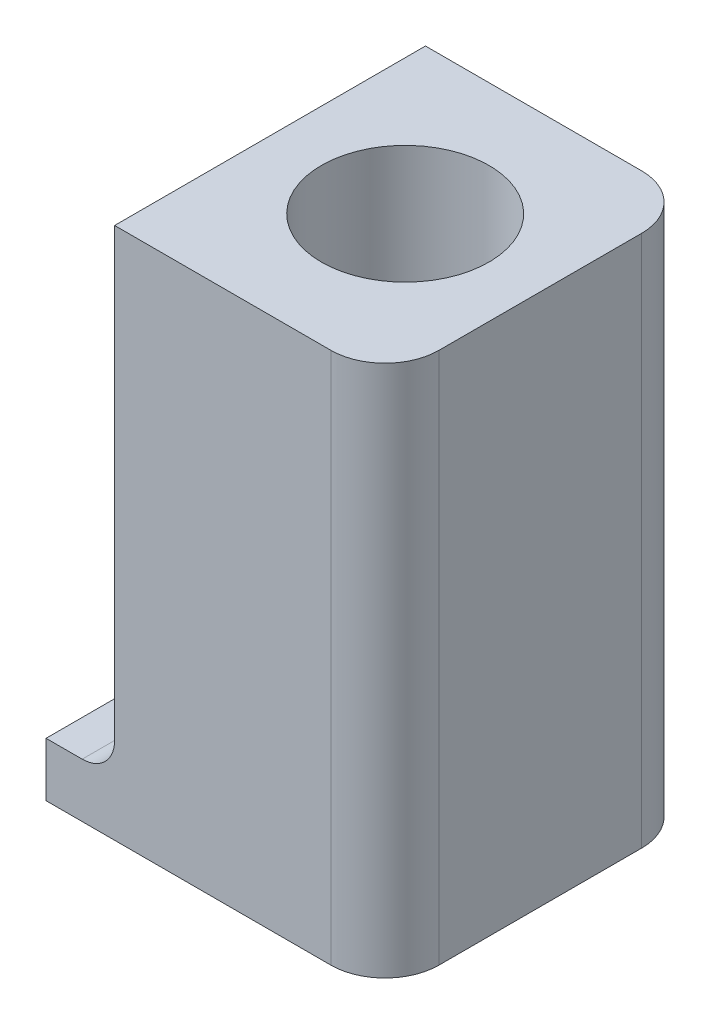
ISO-10303-21;
HEADER;
FILE_DESCRIPTION(('STEP AP214'),'2;1');
FILE_NAME('part.step','',(''),(''),'','','');
FILE_SCHEMA(('AUTOMOTIVE_DESIGN { 1 0 10303 214 1 1 1 1 }'));
ENDSEC;
DATA;
#1=APPLICATION_CONTEXT('core data for automotive mechanical design processes');
#2=APPLICATION_PROTOCOL_DEFINITION('international standard','automotive_design',2000,#1);
#3=PRODUCT_CONTEXT('',#1,'mechanical');
#4=PRODUCT('Part','Part','',(#3));
#5=PRODUCT_RELATED_PRODUCT_CATEGORY('part','',(#4));
#6=PRODUCT_DEFINITION_FORMATION('','',#4);
#7=PRODUCT_DEFINITION_CONTEXT('part definition',#1,'design');
#8=PRODUCT_DEFINITION('design','',#6,#7);
#9=PRODUCT_DEFINITION_SHAPE('','',#8);
#10=(LENGTH_UNIT() NAMED_UNIT(*) SI_UNIT(.MILLI.,.METRE.));
#11=(NAMED_UNIT(*) PLANE_ANGLE_UNIT() SI_UNIT($,.RADIAN.));
#12=(NAMED_UNIT(*) SI_UNIT($,.STERADIAN.) SOLID_ANGLE_UNIT());
#13=UNCERTAINTY_MEASURE_WITH_UNIT(LENGTH_MEASURE(1.E-05),#10,'distance_accuracy_value','');
#14=(GEOMETRIC_REPRESENTATION_CONTEXT(3) GLOBAL_UNCERTAINTY_ASSIGNED_CONTEXT((#13)) GLOBAL_UNIT_ASSIGNED_CONTEXT((#10,
#11,#12)) REPRESENTATION_CONTEXT('',''));
#15=CARTESIAN_POINT('',(0.,0.,0.));
#16=DIRECTION('',(0.,0.,1.));
#17=DIRECTION('',(1.,0.,0.));
#18=AXIS2_PLACEMENT_3D('',#15,#16,#17);
#19=CARTESIAN_POINT('',(88.9,0.,0.));
#20=DIRECTION('',(0.,1.,0.));
#21=DIRECTION('',(0.,0.,1.));
#22=AXIS2_PLACEMENT_3D('',#19,#20,#21);
#23=CYLINDRICAL_SURFACE('',#22,7.874);
#24=CARTESIAN_POINT('',(88.9,50.038,0.));
#25=DIRECTION('',(0.,1.,0.));
#26=DIRECTION('',(0.,0.,1.));
#27=AXIS2_PLACEMENT_3D('',#24,#25,#26);
#28=CIRCLE('',#27,7.874);
#29=CARTESIAN_POINT('',(88.9,50.038,7.874));
#30=VERTEX_POINT('',#29);
#31=EDGE_CURVE('E136',#30,#30,#28,.T.);
#32=CARTESIAN_POINT('',(88.9,4.572,0.));
#33=DIRECTION('',(0.,-1.,0.));
#34=DIRECTION('',(0.,0.,-1.));
#35=AXIS2_PLACEMENT_3D('',#32,#33,#34);
#36=CIRCLE('',#35,7.874);
#37=CARTESIAN_POINT('',(88.9,4.572,7.874));
#38=VERTEX_POINT('',#37);
#39=EDGE_CURVE('E168',#38,#38,#36,.F.);
#40=CARTESIAN_POINT('',(88.9,50.038,7.874));
#41=CARTESIAN_POINT('',(88.9,49.5643958333333,7.874));
#42=CARTESIAN_POINT('',(88.9,49.0907916666667,7.874));
#43=CARTESIAN_POINT('',(88.9,48.1435833333333,7.874));
#44=CARTESIAN_POINT('',(88.9,47.6699791666667,7.874));
#45=CARTESIAN_POINT('',(88.9,46.7227708333333,7.874));
#46=CARTESIAN_POINT('',(88.9,46.2491666666667,7.874));
#47=CARTESIAN_POINT('',(88.9,45.3019583333333,7.874));
#48=CARTESIAN_POINT('',(88.9,44.8283541666667,7.874));
#49=CARTESIAN_POINT('',(88.9,43.8811458333333,7.874));
#50=CARTESIAN_POINT('',(88.9,43.4075416666667,7.874));
#51=CARTESIAN_POINT('',(88.9,42.4603333333333,7.874));
#52=CARTESIAN_POINT('',(88.9,41.9867291666667,7.874));
#53=CARTESIAN_POINT('',(88.9,41.0395208333333,7.874));
#54=CARTESIAN_POINT('',(88.9,40.5659166666667,7.874));
#55=CARTESIAN_POINT('',(88.9,39.6187083333333,7.874));
#56=CARTESIAN_POINT('',(88.9,39.1451041666667,7.874));
#57=CARTESIAN_POINT('',(88.9,38.1978958333333,7.874));
#58=CARTESIAN_POINT('',(88.9,37.7242916666667,7.874));
#59=CARTESIAN_POINT('',(88.9,36.7770833333333,7.874));
#60=CARTESIAN_POINT('',(88.9,36.3034791666667,7.874));
#61=CARTESIAN_POINT('',(88.9,35.3562708333333,7.874));
#62=CARTESIAN_POINT('',(88.9,34.8826666666667,7.874));
#63=CARTESIAN_POINT('',(88.9,33.9354583333333,7.874));
#64=CARTESIAN_POINT('',(88.9,33.4618541666667,7.874));
#65=CARTESIAN_POINT('',(88.9,32.5146458333333,7.874));
#66=CARTESIAN_POINT('',(88.9,32.0410416666667,7.874));
#67=CARTESIAN_POINT('',(88.9,31.0938333333333,7.874));
#68=CARTESIAN_POINT('',(88.9,30.6202291666667,7.874));
#69=CARTESIAN_POINT('',(88.9,29.6730208333333,7.874));
#70=CARTESIAN_POINT('',(88.9,29.1994166666667,7.874));
#71=CARTESIAN_POINT('',(88.9,28.2522083333333,7.874));
#72=CARTESIAN_POINT('',(88.9,27.7786041666667,7.874));
#73=CARTESIAN_POINT('',(88.9,26.8313958333333,7.874));
#74=CARTESIAN_POINT('',(88.9,26.3577916666667,7.874));
#75=CARTESIAN_POINT('',(88.9,25.4105833333333,7.874));
#76=CARTESIAN_POINT('',(88.9,24.9369791666667,7.874));
#77=CARTESIAN_POINT('',(88.9,23.9897708333333,7.874));
#78=CARTESIAN_POINT('',(88.9,23.5161666666667,7.874));
#79=CARTESIAN_POINT('',(88.9,22.5689583333333,7.874));
#80=CARTESIAN_POINT('',(88.9,22.0953541666667,7.874));
#81=CARTESIAN_POINT('',(88.9,21.1481458333333,7.874));
#82=CARTESIAN_POINT('',(88.9,20.6745416666667,7.874));
#83=CARTESIAN_POINT('',(88.9,19.7273333333333,7.874));
#84=CARTESIAN_POINT('',(88.9,19.2537291666667,7.874));
#85=CARTESIAN_POINT('',(88.9,18.3065208333333,7.874));
#86=CARTESIAN_POINT('',(88.9,17.8329166666667,7.874));
#87=CARTESIAN_POINT('',(88.9,16.8857083333333,7.874));
#88=CARTESIAN_POINT('',(88.9,16.4121041666667,7.874));
#89=CARTESIAN_POINT('',(88.9,15.4648958333333,7.874));
#90=CARTESIAN_POINT('',(88.9,14.9912916666667,7.874));
#91=CARTESIAN_POINT('',(88.9,14.0440833333333,7.874));
#92=CARTESIAN_POINT('',(88.9,13.5704791666667,7.874));
#93=CARTESIAN_POINT('',(88.9,12.6232708333333,7.874));
#94=CARTESIAN_POINT('',(88.9,12.1496666666667,7.874));
#95=CARTESIAN_POINT('',(88.9,11.2024583333333,7.874));
#96=CARTESIAN_POINT('',(88.9,10.7288541666667,7.874));
#97=CARTESIAN_POINT('',(88.9,9.78164583333333,7.874));
#98=CARTESIAN_POINT('',(88.9,9.30804166666667,7.874));
#99=CARTESIAN_POINT('',(88.9,8.36083333333333,7.874));
#100=CARTESIAN_POINT('',(88.9,7.88722916666667,7.874));
#101=CARTESIAN_POINT('',(88.9,6.94002083333333,7.874));
#102=CARTESIAN_POINT('',(88.9,6.46641666666667,7.874));
#103=CARTESIAN_POINT('',(88.9,5.51920833333333,7.874));
#104=CARTESIAN_POINT('',(88.9,5.04560416666667,7.874));
#105=CARTESIAN_POINT('',(88.9,4.572,7.874));
#106=B_SPLINE_CURVE_WITH_KNOTS('',3,(#40,#41,#42,#43,#44,#45,#46,#47,#48,#49,#50,#51,#52,#53,
#54,#55,#56,#57,#58,#59,#60,#61,#62,#63,#64,#65,#66,#67,#68,#69,#70,#71,#72,#73,#74,#75,#76,#77,
#78,#79,#80,#81,#82,#83,#84,#85,#86,#87,#88,#89,#90,#91,#92,#93,#94,#95,#96,#97,#98,#99,#100,
#101,#102,#103,#104,#105),.UNSPECIFIED.,.F.,.F.,(4,2,2,2,2,2,2,2,2,2,2,2,2,2,2,2,2,2,2,2,2,2,2,
2,2,2,2,2,2,2,2,2,4),(0.,1.4208125,2.841625,4.2624375,5.68325,7.1040625,8.524875,9.9456875,
11.3665,12.7873125,14.208125,15.6289375,17.04975,18.4705625,19.891375,21.3121875,22.733,
24.1538125,25.574625,26.9954375,28.41625,29.8370625,31.257875,32.6786875,34.0995,35.5203125,
36.941125,38.3619375,39.78275,41.2035625,42.624375,44.0451875,45.466),.UNSPECIFIED.);
#107=EDGE_CURVE('BSEAM37',#30,#38,#106,.T.);
#108=ORIENTED_EDGE('',*,*,#31,.T.);
#109=ORIENTED_EDGE('',*,*,#39,.F.);
#110=ORIENTED_EDGE('',*,*,#107,.T.);
#111=ORIENTED_EDGE('',*,*,#107,.F.);
#112=EDGE_LOOP('',(#108,#110,#109,#111));
#113=FACE_BOUND('',#112,.T.);
#114=ADVANCED_FACE('F37',(#113),#23,.F.);
#115=CARTESIAN_POINT('',(-96.52,0.,14.605));
#116=DIRECTION('',(0.,0.,1.));
#117=DIRECTION('',(1.,0.,0.));
#118=AXIS2_PLACEMENT_3D('',#115,#116,#117);
#119=PLANE('',#118);
#120=DIRECTION('',(0.,-1.,0.));
#121=VECTOR('',#120,1.);
#122=CARTESIAN_POINT('',(69.7544054007749,-2.7270950117173,14.605));
#123=LINE('',#122,#121);
#124=CARTESIAN_POINT('',(69.7544054007749,5.08,14.605));
#125=VERTEX_POINT('',#124);
#126=CARTESIAN_POINT('',(69.7544054007749,0.,14.605));
#127=VERTEX_POINT('',#126);
#128=EDGE_CURVE('E52',#125,#127,#123,.T.);
#129=ORIENTED_EDGE('',*,*,#128,.T.);
#130=DIRECTION('',(1.,0.,0.));
#131=VECTOR('',#130,1.);
#132=CARTESIAN_POINT('',(-96.52,0.,14.605));
#133=LINE('',#132,#131);
#134=CARTESIAN_POINT('',(96.52,0.,14.605));
#135=VERTEX_POINT('',#134);
#136=EDGE_CURVE('E157',#127,#135,#133,.T.);
#137=ORIENTED_EDGE('',*,*,#136,.T.);
#138=DIRECTION('',(0.,1.,0.));
#139=VECTOR('',#138,1.);
#140=CARTESIAN_POINT('',(96.52,0.,14.605));
#141=LINE('',#140,#139);
#142=CARTESIAN_POINT('',(96.52,50.038,14.605));
#143=VERTEX_POINT('',#142);
#144=EDGE_CURVE('E171',#135,#143,#141,.T.);
#145=ORIENTED_EDGE('',*,*,#144,.T.);
#146=DIRECTION('',(1.,0.,0.));
#147=VECTOR('',#146,1.);
#148=CARTESIAN_POINT('',(-96.52,50.038,14.605));
#149=LINE('',#148,#147);
#150=CARTESIAN_POINT('',(76.1999999999999,50.038,14.605));
#151=VERTEX_POINT('',#150);
#152=EDGE_CURVE('E145',#151,#143,#149,.T.);
#153=ORIENTED_EDGE('',*,*,#152,.F.);
#154=DIRECTION('',(0.,-1.,0.));
#155=VECTOR('',#154,1.);
#156=CARTESIAN_POINT('',(76.2,0.,14.605));
#157=LINE('',#156,#155);
#158=CARTESIAN_POINT('',(76.2,8.128,14.605));
#159=VERTEX_POINT('',#158);
#160=EDGE_CURVE('E125',#151,#159,#157,.T.);
#161=ORIENTED_EDGE('',*,*,#160,.T.);
#162=CARTESIAN_POINT('',(73.152,8.128,14.605));
#163=DIRECTION('',(0.,0.,1.));
#164=DIRECTION('',(1.,0.,0.));
#165=AXIS2_PLACEMENT_3D('',#162,#163,#164);
#166=CIRCLE('',#165,3.048);
#167=CARTESIAN_POINT('',(73.152,5.08,14.605));
#168=VERTEX_POINT('',#167);
#169=EDGE_CURVE('E45',#159,#168,#166,.F.);
#170=ORIENTED_EDGE('',*,*,#169,.T.);
#171=DIRECTION('',(-1.,0.,0.));
#172=VECTOR('',#171,1.);
#173=CARTESIAN_POINT('',(0.,5.08000000000001,14.605));
#174=LINE('',#173,#172);
#175=EDGE_CURVE('E128',#168,#125,#174,.T.);
#176=ORIENTED_EDGE('',*,*,#175,.T.);
#177=EDGE_LOOP('',(#129,#137,#145,#153,#161,#170,#176));
#178=FACE_BOUND('',#177,.T.);
#179=ADVANCED_FACE('F182',(#178),#119,.T.);
#180=CARTESIAN_POINT('',(-96.52,0.,-14.605));
#181=DIRECTION('',(0.,0.,-1.));
#182=DIRECTION('',(-1.,0.,0.));
#183=AXIS2_PLACEMENT_3D('',#180,#181,#182);
#184=PLANE('',#183);
#185=DIRECTION('',(0.,-1.,0.));
#186=VECTOR('',#185,1.);
#187=CARTESIAN_POINT('',(69.7544054007749,-2.7270950117173,-14.605));
#188=LINE('',#187,#186);
#189=CARTESIAN_POINT('',(69.7544054007749,5.08000000000001,-14.605));
#190=VERTEX_POINT('',#189);
#191=CARTESIAN_POINT('',(69.7544054007749,0.,-14.605));
#192=VERTEX_POINT('',#191);
#193=EDGE_CURVE('E107',#190,#192,#188,.T.);
#194=ORIENTED_EDGE('',*,*,#193,.F.);
#195=DIRECTION('',(-1.,0.,0.));
#196=VECTOR('',#195,1.);
#197=CARTESIAN_POINT('',(0.,5.08000000000001,-14.605));
#198=LINE('',#197,#196);
#199=CARTESIAN_POINT('',(73.152,5.08,-14.605));
#200=VERTEX_POINT('',#199);
#201=EDGE_CURVE('E117',#200,#190,#198,.T.);
#202=ORIENTED_EDGE('',*,*,#201,.F.);
#203=CARTESIAN_POINT('',(73.152,8.128,-14.605));
#204=DIRECTION('',(0.,0.,-1.));
#205=DIRECTION('',(-1.,0.,0.));
#206=AXIS2_PLACEMENT_3D('',#203,#204,#205);
#207=CIRCLE('',#206,3.048);
#208=CARTESIAN_POINT('',(76.2,8.128,-14.605));
#209=VERTEX_POINT('',#208);
#210=EDGE_CURVE('E179',#200,#209,#207,.F.);
#211=ORIENTED_EDGE('',*,*,#210,.T.);
#212=DIRECTION('',(0.,-1.,0.));
#213=VECTOR('',#212,1.);
#214=CARTESIAN_POINT('',(76.2,0.,-14.605));
#215=LINE('',#214,#213);
#216=CARTESIAN_POINT('',(76.2,50.038,-14.605));
#217=VERTEX_POINT('',#216);
#218=EDGE_CURVE('E126',#217,#209,#215,.T.);
#219=ORIENTED_EDGE('',*,*,#218,.F.);
#220=DIRECTION('',(-1.,0.,0.));
#221=VECTOR('',#220,1.);
#222=CARTESIAN_POINT('',(-96.52,50.038,-14.605));
#223=LINE('',#222,#221);
#224=CARTESIAN_POINT('',(96.52,50.038,-14.605));
#225=VERTEX_POINT('',#224);
#226=EDGE_CURVE('E142',#225,#217,#223,.T.);
#227=ORIENTED_EDGE('',*,*,#226,.F.);
#228=DIRECTION('',(0.,1.,0.));
#229=VECTOR('',#228,1.);
#230=CARTESIAN_POINT('',(96.52,0.,-14.605));
#231=LINE('',#230,#229);
#232=CARTESIAN_POINT('',(96.52,0.,-14.605));
#233=VERTEX_POINT('',#232);
#234=EDGE_CURVE('E165',#233,#225,#231,.T.);
#235=ORIENTED_EDGE('',*,*,#234,.F.);
#236=DIRECTION('',(-1.,0.,0.));
#237=VECTOR('',#236,1.);
#238=CARTESIAN_POINT('',(-96.52,0.,-14.605));
#239=LINE('',#238,#237);
#240=EDGE_CURVE('E119',#233,#192,#239,.T.);
#241=ORIENTED_EDGE('',*,*,#240,.T.);
#242=EDGE_LOOP('',(#194,#202,#211,#219,#227,#235,#241));
#243=FACE_BOUND('',#242,.T.);
#244=ADVANCED_FACE('F116',(#243),#184,.T.);
#245=CARTESIAN_POINT('',(0.,0.,0.));
#246=DIRECTION('',(0.,1.,0.));
#247=DIRECTION('',(0.,0.,1.));
#248=AXIS2_PLACEMENT_3D('',#245,#246,#247);
#249=PLANE('',#248);
#250=ORIENTED_EDGE('',*,*,#136,.F.);
#251=DIRECTION('',(0.,0.,-1.));
#252=VECTOR('',#251,1.);
#253=CARTESIAN_POINT('',(69.7544054007749,0.,0.));
#254=LINE('',#253,#252);
#255=EDGE_CURVE('E209',#127,#192,#254,.T.);
#256=ORIENTED_EDGE('',*,*,#255,.T.);
#257=ORIENTED_EDGE('',*,*,#240,.F.);
#258=CARTESIAN_POINT('',(96.52,0.,-9.525));
#259=DIRECTION('',(0.,1.,0.));
#260=DIRECTION('',(0.,0.,-1.));
#261=AXIS2_PLACEMENT_3D('',#258,#259,#260);
#262=CIRCLE('',#261,5.07999999999999);
#263=CARTESIAN_POINT('',(101.6,0.,-9.525));
#264=VERTEX_POINT('',#263);
#265=EDGE_CURVE('E153',#264,#233,#262,.T.);
#266=ORIENTED_EDGE('',*,*,#265,.F.);
#267=DIRECTION('',(0.,0.,-1.));
#268=VECTOR('',#267,1.);
#269=CARTESIAN_POINT('',(101.6,0.,9.525));
#270=LINE('',#269,#268);
#271=CARTESIAN_POINT('',(101.6,0.,9.525));
#272=VERTEX_POINT('',#271);
#273=EDGE_CURVE('E162',#272,#264,#270,.T.);
#274=ORIENTED_EDGE('',*,*,#273,.F.);
#275=CARTESIAN_POINT('',(96.52,0.,9.525));
#276=DIRECTION('',(0.,1.,0.));
#277=DIRECTION('',(0.,0.,1.));
#278=AXIS2_PLACEMENT_3D('',#275,#276,#277);
#279=CIRCLE('',#278,5.08);
#280=EDGE_CURVE('E159',#135,#272,#279,.T.);
#281=ORIENTED_EDGE('',*,*,#280,.F.);
#282=EDGE_LOOP('',(#250,#256,#257,#266,#274,#281));
#283=FACE_BOUND('',#282,.T.);
#284=CARTESIAN_POINT('',(88.9,0.,0.));
#285=DIRECTION('',(0.,-1.,0.));
#286=DIRECTION('',(0.,0.,-1.));
#287=AXIS2_PLACEMENT_3D('',#284,#285,#286);
#288=CIRCLE('',#287,4.191);
#289=CARTESIAN_POINT('',(88.9,0.,-4.191));
#290=VERTEX_POINT('',#289);
#291=EDGE_CURVE('E130',#290,#290,#288,.T.);
#292=ORIENTED_EDGE('',*,*,#291,.F.);
#293=EDGE_LOOP('',(#292));
#294=FACE_BOUND('',#293,.T.);
#295=ADVANCED_FACE('F207',(#283,#294),#249,.F.);
#296=CARTESIAN_POINT('',(96.52,0.,-9.525));
#297=DIRECTION('',(0.,1.,0.));
#298=DIRECTION('',(0.,0.,1.));
#299=AXIS2_PLACEMENT_3D('',#296,#297,#298);
#300=CYLINDRICAL_SURFACE('',#299,5.07999999999999);
#301=ORIENTED_EDGE('',*,*,#234,.T.);
#302=CARTESIAN_POINT('',(96.52,50.038,-9.525));
#303=DIRECTION('',(0.,1.,0.));
#304=DIRECTION('',(0.,0.,-1.));
#305=AXIS2_PLACEMENT_3D('',#302,#303,#304);
#306=CIRCLE('',#305,5.07999999999999);
#307=CARTESIAN_POINT('',(101.6,50.038,-9.525));
#308=VERTEX_POINT('',#307);
#309=EDGE_CURVE('E139',#308,#225,#306,.T.);
#310=ORIENTED_EDGE('',*,*,#309,.F.);
#311=DIRECTION('',(0.,1.,0.));
#312=VECTOR('',#311,1.);
#313=CARTESIAN_POINT('',(101.6,0.,-9.525));
#314=LINE('',#313,#312);
#315=EDGE_CURVE('E166',#264,#308,#314,.T.);
#316=ORIENTED_EDGE('',*,*,#315,.F.);
#317=ORIENTED_EDGE('',*,*,#265,.T.);
#318=EDGE_LOOP('',(#301,#310,#316,#317));
#319=FACE_BOUND('',#318,.T.);
#320=ADVANCED_FACE('F205',(#319),#300,.T.);
#321=CARTESIAN_POINT('',(101.6,0.,9.525));
#322=DIRECTION('',(1.,0.,0.));
#323=DIRECTION('',(0.,0.,-1.));
#324=AXIS2_PLACEMENT_3D('',#321,#322,#323);
#325=PLANE('',#324);
#326=ORIENTED_EDGE('',*,*,#315,.T.);
#327=DIRECTION('',(0.,0.,-1.));
#328=VECTOR('',#327,1.);
#329=CARTESIAN_POINT('',(101.6,50.038,9.525));
#330=LINE('',#329,#328);
#331=CARTESIAN_POINT('',(101.6,50.038,9.525));
#332=VERTEX_POINT('',#331);
#333=EDGE_CURVE('E150',#332,#308,#330,.T.);
#334=ORIENTED_EDGE('',*,*,#333,.F.);
#335=DIRECTION('',(0.,1.,0.));
#336=VECTOR('',#335,1.);
#337=CARTESIAN_POINT('',(101.6,0.,9.525));
#338=LINE('',#337,#336);
#339=EDGE_CURVE('E169',#272,#332,#338,.T.);
#340=ORIENTED_EDGE('',*,*,#339,.F.);
#341=ORIENTED_EDGE('',*,*,#273,.T.);
#342=EDGE_LOOP('',(#326,#334,#340,#341));
#343=FACE_BOUND('',#342,.T.);
#344=ADVANCED_FACE('F201',(#343),#325,.T.);
#345=CARTESIAN_POINT('',(96.52,0.,9.525));
#346=DIRECTION('',(0.,1.,0.));
#347=DIRECTION('',(0.,0.,1.));
#348=AXIS2_PLACEMENT_3D('',#345,#346,#347);
#349=CYLINDRICAL_SURFACE('',#348,5.08);
#350=ORIENTED_EDGE('',*,*,#339,.T.);
#351=CARTESIAN_POINT('',(96.52,50.038,9.525));
#352=DIRECTION('',(0.,1.,0.));
#353=DIRECTION('',(0.,0.,1.));
#354=AXIS2_PLACEMENT_3D('',#351,#352,#353);
#355=CIRCLE('',#354,5.08);
#356=EDGE_CURVE('E147',#143,#332,#355,.T.);
#357=ORIENTED_EDGE('',*,*,#356,.F.);
#358=ORIENTED_EDGE('',*,*,#144,.F.);
#359=ORIENTED_EDGE('',*,*,#280,.T.);
#360=EDGE_LOOP('',(#350,#357,#358,#359));
#361=FACE_BOUND('',#360,.T.);
#362=ADVANCED_FACE('F197',(#361),#349,.T.);
#363=CARTESIAN_POINT('',(96.52,50.038,-9.525));
#364=DIRECTION('',(0.,-1.,0.));
#365=DIRECTION('',(0.,0.,-1.));
#366=AXIS2_PLACEMENT_3D('',#363,#364,#365);
#367=PLANE('',#366);
#368=ORIENTED_EDGE('',*,*,#226,.T.);
#369=DIRECTION('',(0.,0.,-1.));
#370=VECTOR('',#369,1.);
#371=CARTESIAN_POINT('',(76.2,50.038,14.605));
#372=LINE('',#371,#370);
#373=EDGE_CURVE('E134',#151,#217,#372,.T.);
#374=ORIENTED_EDGE('',*,*,#373,.F.);
#375=ORIENTED_EDGE('',*,*,#152,.T.);
#376=ORIENTED_EDGE('',*,*,#356,.T.);
#377=ORIENTED_EDGE('',*,*,#333,.T.);
#378=ORIENTED_EDGE('',*,*,#309,.T.);
#379=EDGE_LOOP('',(#368,#374,#375,#376,#377,#378));
#380=FACE_BOUND('',#379,.T.);
#381=ORIENTED_EDGE('',*,*,#31,.F.);
#382=EDGE_LOOP('',(#381));
#383=FACE_BOUND('',#382,.T.);
#384=ADVANCED_FACE('F190',(#380,#383),#367,.F.);
#385=CARTESIAN_POINT('',(0.,5.08000000000001,14.605));
#386=DIRECTION('',(0.,-1.,0.));
#387=DIRECTION('',(1.,0.,0.));
#388=AXIS2_PLACEMENT_3D('',#385,#386,#387);
#389=PLANE('',#388);
#390=ORIENTED_EDGE('',*,*,#201,.T.);
#391=DIRECTION('',(0.,0.,1.));
#392=VECTOR('',#391,1.);
#393=CARTESIAN_POINT('',(69.7544054007749,5.08,14.605));
#394=LINE('',#393,#392);
#395=EDGE_CURVE('E11',#190,#125,#394,.T.);
#396=ORIENTED_EDGE('',*,*,#395,.T.);
#397=ORIENTED_EDGE('',*,*,#175,.F.);
#398=DIRECTION('',(0.,0.,-1.));
#399=VECTOR('',#398,1.);
#400=CARTESIAN_POINT('',(73.152,5.08,-14.605));
#401=LINE('',#400,#399);
#402=EDGE_CURVE('E124',#168,#200,#401,.T.);
#403=ORIENTED_EDGE('',*,*,#402,.T.);
#404=EDGE_LOOP('',(#390,#396,#397,#403));
#405=FACE_BOUND('',#404,.T.);
#406=ADVANCED_FACE('F122',(#405),#389,.F.);
#407=CARTESIAN_POINT('',(76.2,0.,14.605));
#408=DIRECTION('',(1.,0.,0.));
#409=DIRECTION('',(0.,0.,-1.));
#410=AXIS2_PLACEMENT_3D('',#407,#408,#409);
#411=PLANE('',#410);
#412=ORIENTED_EDGE('',*,*,#218,.T.);
#413=DIRECTION('',(0.,0.,-1.));
#414=VECTOR('',#413,1.);
#415=CARTESIAN_POINT('',(76.2,8.128,14.605));
#416=LINE('',#415,#414);
#417=EDGE_CURVE('E59',#209,#159,#416,.F.);
#418=ORIENTED_EDGE('',*,*,#417,.T.);
#419=ORIENTED_EDGE('',*,*,#160,.F.);
#420=ORIENTED_EDGE('',*,*,#373,.T.);
#421=EDGE_LOOP('',(#412,#418,#419,#420));
#422=FACE_BOUND('',#421,.T.);
#423=ADVANCED_FACE('F187',(#422),#411,.F.);
#424=CARTESIAN_POINT('',(88.9,4.572,0.));
#425=DIRECTION('',(0.,-1.,0.));
#426=DIRECTION('',(0.,0.,-1.));
#427=AXIS2_PLACEMENT_3D('',#424,#425,#426);
#428=PLANE('',#427);
#429=CARTESIAN_POINT('',(88.9,4.572,0.));
#430=DIRECTION('',(0.,-1.,0.));
#431=DIRECTION('',(0.,0.,-1.));
#432=AXIS2_PLACEMENT_3D('',#429,#430,#431);
#433=CIRCLE('',#432,4.191);
#434=CARTESIAN_POINT('',(88.9,4.572,-4.191));
#435=VERTEX_POINT('',#434);
#436=EDGE_CURVE('E210',#435,#435,#433,.T.);
#437=ORIENTED_EDGE('',*,*,#436,.T.);
#438=EDGE_LOOP('',(#437));
#439=FACE_BOUND('',#438,.T.);
#440=ORIENTED_EDGE('',*,*,#39,.T.);
#441=EDGE_LOOP('',(#440));
#442=FACE_BOUND('',#441,.T.);
#443=ADVANCED_FACE('F251',(#439,#442),#428,.F.);
#444=CARTESIAN_POINT('',(88.9,4.572,0.));
#445=DIRECTION('',(0.,-1.,0.));
#446=DIRECTION('',(0.,0.,-1.));
#447=AXIS2_PLACEMENT_3D('',#444,#445,#446);
#448=CYLINDRICAL_SURFACE('',#447,4.191);
#449=ORIENTED_EDGE('',*,*,#436,.F.);
#450=EDGE_LOOP('',(#449));
#451=FACE_BOUND('',#450,.T.);
#452=ORIENTED_EDGE('',*,*,#291,.T.);
#453=EDGE_LOOP('',(#452));
#454=FACE_BOUND('',#453,.T.);
#455=ADVANCED_FACE('F219',(#451,#454),#448,.F.);
#456=CARTESIAN_POINT('',(73.152,8.128,14.605));
#457=DIRECTION('',(0.,0.,1.));
#458=DIRECTION('',(1.,0.,0.));
#459=AXIS2_PLACEMENT_3D('',#456,#457,#458);
#460=CYLINDRICAL_SURFACE('',#459,3.048);
#461=ORIENTED_EDGE('',*,*,#169,.F.);
#462=ORIENTED_EDGE('',*,*,#417,.F.);
#463=ORIENTED_EDGE('',*,*,#210,.F.);
#464=ORIENTED_EDGE('',*,*,#402,.F.);
#465=EDGE_LOOP('',(#461,#462,#463,#464));
#466=FACE_BOUND('',#465,.T.);
#467=ADVANCED_FACE('F39',(#466),#460,.F.);
#468=CARTESIAN_POINT('',(69.7544054007749,-2.7270950117173,14.605));
#469=DIRECTION('',(1.,0.,0.));
#470=DIRECTION('',(0.,0.,-1.));
#471=AXIS2_PLACEMENT_3D('',#468,#469,#470);
#472=PLANE('',#471);
#473=ORIENTED_EDGE('',*,*,#128,.F.);
#474=ORIENTED_EDGE('',*,*,#395,.F.);
#475=ORIENTED_EDGE('',*,*,#193,.T.);
#476=ORIENTED_EDGE('',*,*,#255,.F.);
#477=EDGE_LOOP('',(#473,#474,#475,#476));
#478=FACE_BOUND('',#477,.T.);
#479=ADVANCED_FACE('F106',(#478),#472,.F.);
#480=CLOSED_SHELL('',(#114,#179,#244,#295,#320,#344,#362,#384,#406,#423,#443,#455,#467,#479));
#481=MANIFOLD_SOLID_BREP('B2',#480);
#482=ADVANCED_BREP_SHAPE_REPRESENTATION('',(#18,#481),#14);
#483=SHAPE_DEFINITION_REPRESENTATION(#9,#482);
ENDSEC;
END-ISO-10303-21;
